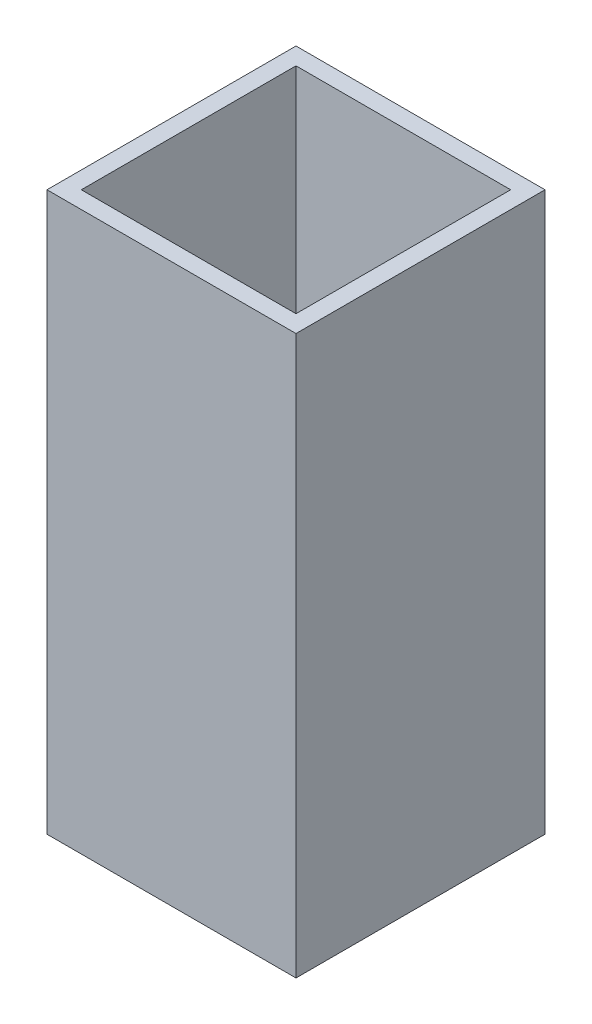
ISO-10303-21;
HEADER;
FILE_DESCRIPTION(('STEP AP214'),'2;1');
FILE_NAME('part.step','',(''),(''),'','','');
FILE_SCHEMA(('AUTOMOTIVE_DESIGN { 1 0 10303 214 1 1 1 1 }'));
ENDSEC;
DATA;
#1=APPLICATION_CONTEXT('core data for automotive mechanical design processes');
#2=APPLICATION_PROTOCOL_DEFINITION('international standard','automotive_design',2000,#1);
#3=PRODUCT_CONTEXT('',#1,'mechanical');
#4=PRODUCT('Part','Part','',(#3));
#5=PRODUCT_RELATED_PRODUCT_CATEGORY('part','',(#4));
#6=PRODUCT_DEFINITION_FORMATION('','',#4);
#7=PRODUCT_DEFINITION_CONTEXT('part definition',#1,'design');
#8=PRODUCT_DEFINITION('design','',#6,#7);
#9=PRODUCT_DEFINITION_SHAPE('','',#8);
#10=(LENGTH_UNIT() NAMED_UNIT(*) SI_UNIT(.MILLI.,.METRE.));
#11=(NAMED_UNIT(*) PLANE_ANGLE_UNIT() SI_UNIT($,.RADIAN.));
#12=(NAMED_UNIT(*) SI_UNIT($,.STERADIAN.) SOLID_ANGLE_UNIT());
#13=UNCERTAINTY_MEASURE_WITH_UNIT(LENGTH_MEASURE(1.E-05),#10,'distance_accuracy_value','');
#14=(GEOMETRIC_REPRESENTATION_CONTEXT(3) GLOBAL_UNCERTAINTY_ASSIGNED_CONTEXT((#13)) GLOBAL_UNIT_ASSIGNED_CONTEXT((#10,
#11,#12)) REPRESENTATION_CONTEXT('',''));
#15=CARTESIAN_POINT('',(0.,0.,0.));
#16=DIRECTION('',(0.,0.,1.));
#17=DIRECTION('',(1.,0.,0.));
#18=AXIS2_PLACEMENT_3D('',#15,#16,#17);
#19=CARTESIAN_POINT('',(0.,65.,0.));
#20=DIRECTION('',(0.,-1.,0.));
#21=DIRECTION('',(0.,0.,-1.));
#22=AXIS2_PLACEMENT_3D('',#19,#20,#21);
#23=PLANE('',#22);
#24=DIRECTION('',(0.,0.,-1.));
#25=VECTOR('',#24,1.);
#26=CARTESIAN_POINT('',(14.5,65.,14.5));
#27=LINE('',#26,#25);
#28=CARTESIAN_POINT('',(14.5,65.,14.5));
#29=VERTEX_POINT('',#28);
#30=CARTESIAN_POINT('',(14.5,65.,-14.5));
#31=VERTEX_POINT('',#30);
#32=EDGE_CURVE('E130',#29,#31,#27,.T.);
#33=ORIENTED_EDGE('',*,*,#32,.T.);
#34=DIRECTION('',(-1.,0.,0.));
#35=VECTOR('',#34,1.);
#36=CARTESIAN_POINT('',(-14.5,65.,-14.5));
#37=LINE('',#36,#35);
#38=CARTESIAN_POINT('',(-14.5,65.,-14.5));
#39=VERTEX_POINT('',#38);
#40=EDGE_CURVE('E133',#31,#39,#37,.T.);
#41=ORIENTED_EDGE('',*,*,#40,.T.);
#42=DIRECTION('',(0.,0.,1.));
#43=VECTOR('',#42,1.);
#44=CARTESIAN_POINT('',(-14.5,65.,14.5));
#45=LINE('',#44,#43);
#46=CARTESIAN_POINT('',(-14.5,65.,14.5));
#47=VERTEX_POINT('',#46);
#48=EDGE_CURVE('E136',#39,#47,#45,.T.);
#49=ORIENTED_EDGE('',*,*,#48,.T.);
#50=DIRECTION('',(1.,0.,0.));
#51=VECTOR('',#50,1.);
#52=CARTESIAN_POINT('',(-14.5,65.,14.5));
#53=LINE('',#52,#51);
#54=EDGE_CURVE('E138',#47,#29,#53,.T.);
#55=ORIENTED_EDGE('',*,*,#54,.T.);
#56=EDGE_LOOP('',(#33,#41,#49,#55));
#57=FACE_BOUND('',#56,.T.);
#58=DIRECTION('',(0.,0.,-1.));
#59=VECTOR('',#58,1.);
#60=CARTESIAN_POINT('',(12.5,65.,0.));
#61=LINE('',#60,#59);
#62=CARTESIAN_POINT('',(12.5,65.,12.5));
#63=VERTEX_POINT('',#62);
#64=CARTESIAN_POINT('',(12.5,65.,-12.5));
#65=VERTEX_POINT('',#64);
#66=EDGE_CURVE('E118',#63,#65,#61,.T.);
#67=ORIENTED_EDGE('',*,*,#66,.F.);
#68=DIRECTION('',(1.,0.,0.));
#69=VECTOR('',#68,1.);
#70=CARTESIAN_POINT('',(0.,65.,12.5));
#71=LINE('',#70,#69);
#72=CARTESIAN_POINT('',(-12.5,65.,12.5));
#73=VERTEX_POINT('',#72);
#74=EDGE_CURVE('E103',#73,#63,#71,.T.);
#75=ORIENTED_EDGE('',*,*,#74,.F.);
#76=DIRECTION('',(0.,0.,1.));
#77=VECTOR('',#76,1.);
#78=CARTESIAN_POINT('',(-12.5,65.,0.));
#79=LINE('',#78,#77);
#80=CARTESIAN_POINT('',(-12.5,65.,-12.5));
#81=VERTEX_POINT('',#80);
#82=EDGE_CURVE('E127',#81,#73,#79,.T.);
#83=ORIENTED_EDGE('',*,*,#82,.F.);
#84=DIRECTION('',(-1.,0.,0.));
#85=VECTOR('',#84,1.);
#86=CARTESIAN_POINT('',(0.,65.,-12.5));
#87=LINE('',#86,#85);
#88=EDGE_CURVE('E120',#65,#81,#87,.T.);
#89=ORIENTED_EDGE('',*,*,#88,.F.);
#90=EDGE_LOOP('',(#67,#75,#83,#89));
#91=FACE_BOUND('',#90,.T.);
#92=ADVANCED_FACE('F33',(#57,#91),#23,.F.);
#93=CARTESIAN_POINT('',(0.,0.,0.));
#94=DIRECTION('',(0.,-1.,0.));
#95=DIRECTION('',(0.,0.,-1.));
#96=AXIS2_PLACEMENT_3D('',#93,#94,#95);
#97=PLANE('',#96);
#98=DIRECTION('',(0.,0.,-1.));
#99=VECTOR('',#98,1.);
#100=CARTESIAN_POINT('',(14.5,0.,14.5));
#101=LINE('',#100,#99);
#102=CARTESIAN_POINT('',(14.5,0.,14.5));
#103=VERTEX_POINT('',#102);
#104=CARTESIAN_POINT('',(14.5,0.,-14.5));
#105=VERTEX_POINT('',#104);
#106=EDGE_CURVE('E141',#103,#105,#101,.T.);
#107=ORIENTED_EDGE('',*,*,#106,.F.);
#108=DIRECTION('',(1.,0.,0.));
#109=VECTOR('',#108,1.);
#110=CARTESIAN_POINT('',(-14.5,0.,14.5));
#111=LINE('',#110,#109);
#112=CARTESIAN_POINT('',(-14.5,0.,14.5));
#113=VERTEX_POINT('',#112);
#114=EDGE_CURVE('E134',#113,#103,#111,.T.);
#115=ORIENTED_EDGE('',*,*,#114,.F.);
#116=DIRECTION('',(0.,0.,1.));
#117=VECTOR('',#116,1.);
#118=CARTESIAN_POINT('',(-14.5,0.,14.5));
#119=LINE('',#118,#117);
#120=CARTESIAN_POINT('',(-14.5,0.,-14.5));
#121=VERTEX_POINT('',#120);
#122=EDGE_CURVE('E146',#121,#113,#119,.T.);
#123=ORIENTED_EDGE('',*,*,#122,.F.);
#124=DIRECTION('',(-1.,0.,0.));
#125=VECTOR('',#124,1.);
#126=CARTESIAN_POINT('',(-14.5,0.,-14.5));
#127=LINE('',#126,#125);
#128=EDGE_CURVE('E144',#105,#121,#127,.T.);
#129=ORIENTED_EDGE('',*,*,#128,.F.);
#130=EDGE_LOOP('',(#107,#115,#123,#129));
#131=FACE_BOUND('',#130,.T.);
#132=DIRECTION('',(1.,0.,0.));
#133=VECTOR('',#132,1.);
#134=CARTESIAN_POINT('',(0.,0.,12.5));
#135=LINE('',#134,#133);
#136=CARTESIAN_POINT('',(-12.5,0.,12.5));
#137=VERTEX_POINT('',#136);
#138=CARTESIAN_POINT('',(12.5,0.,12.5));
#139=VERTEX_POINT('',#138);
#140=EDGE_CURVE('E101',#137,#139,#135,.T.);
#141=ORIENTED_EDGE('',*,*,#140,.T.);
#142=DIRECTION('',(0.,0.,-1.));
#143=VECTOR('',#142,1.);
#144=CARTESIAN_POINT('',(12.5,0.,0.));
#145=LINE('',#144,#143);
#146=CARTESIAN_POINT('',(12.5,0.,-12.5));
#147=VERTEX_POINT('',#146);
#148=EDGE_CURVE('E109',#139,#147,#145,.T.);
#149=ORIENTED_EDGE('',*,*,#148,.T.);
#150=DIRECTION('',(-1.,0.,0.));
#151=VECTOR('',#150,1.);
#152=CARTESIAN_POINT('',(0.,0.,-12.5));
#153=LINE('',#152,#151);
#154=CARTESIAN_POINT('',(-12.5,0.,-12.5));
#155=VERTEX_POINT('',#154);
#156=EDGE_CURVE('E115',#147,#155,#153,.T.);
#157=ORIENTED_EDGE('',*,*,#156,.T.);
#158=DIRECTION('',(0.,0.,1.));
#159=VECTOR('',#158,1.);
#160=CARTESIAN_POINT('',(-12.5,0.,0.));
#161=LINE('',#160,#159);
#162=EDGE_CURVE('E55',#155,#137,#161,.T.);
#163=ORIENTED_EDGE('',*,*,#162,.T.);
#164=EDGE_LOOP('',(#141,#149,#157,#163));
#165=FACE_BOUND('',#164,.T.);
#166=ADVANCED_FACE('F117',(#131,#165),#97,.T.);
#167=CARTESIAN_POINT('',(14.5,65.,14.5));
#168=DIRECTION('',(-1.,0.,0.));
#169=DIRECTION('',(0.,0.,1.));
#170=AXIS2_PLACEMENT_3D('',#167,#168,#169);
#171=PLANE('',#170);
#172=ORIENTED_EDGE('',*,*,#106,.T.);
#173=DIRECTION('',(0.,-1.,0.));
#174=VECTOR('',#173,1.);
#175=CARTESIAN_POINT('',(14.5,65.,-14.5));
#176=LINE('',#175,#174);
#177=EDGE_CURVE('E11',#31,#105,#176,.T.);
#178=ORIENTED_EDGE('',*,*,#177,.F.);
#179=ORIENTED_EDGE('',*,*,#32,.F.);
#180=DIRECTION('',(0.,-1.,0.));
#181=VECTOR('',#180,1.);
#182=CARTESIAN_POINT('',(14.5,65.,14.5));
#183=LINE('',#182,#181);
#184=EDGE_CURVE('E140',#29,#103,#183,.T.);
#185=ORIENTED_EDGE('',*,*,#184,.T.);
#186=EDGE_LOOP('',(#172,#178,#179,#185));
#187=FACE_BOUND('',#186,.T.);
#188=ADVANCED_FACE('F35',(#187),#171,.F.);
#189=CARTESIAN_POINT('',(-14.5,65.,-14.5));
#190=DIRECTION('',(0.,0.,1.));
#191=DIRECTION('',(1.,0.,0.));
#192=AXIS2_PLACEMENT_3D('',#189,#190,#191);
#193=PLANE('',#192);
#194=ORIENTED_EDGE('',*,*,#128,.T.);
#195=DIRECTION('',(0.,-1.,0.));
#196=VECTOR('',#195,1.);
#197=CARTESIAN_POINT('',(-14.5,65.,-14.5));
#198=LINE('',#197,#196);
#199=EDGE_CURVE('E41',#39,#121,#198,.T.);
#200=ORIENTED_EDGE('',*,*,#199,.F.);
#201=ORIENTED_EDGE('',*,*,#40,.F.);
#202=ORIENTED_EDGE('',*,*,#177,.T.);
#203=EDGE_LOOP('',(#194,#200,#201,#202));
#204=FACE_BOUND('',#203,.T.);
#205=ADVANCED_FACE('F173',(#204),#193,.F.);
#206=CARTESIAN_POINT('',(-14.5,65.,14.5));
#207=DIRECTION('',(1.,0.,0.));
#208=DIRECTION('',(0.,0.,-1.));
#209=AXIS2_PLACEMENT_3D('',#206,#207,#208);
#210=PLANE('',#209);
#211=ORIENTED_EDGE('',*,*,#122,.T.);
#212=DIRECTION('',(0.,-1.,0.));
#213=VECTOR('',#212,1.);
#214=CARTESIAN_POINT('',(-14.5,65.,14.5));
#215=LINE('',#214,#213);
#216=EDGE_CURVE('E151',#47,#113,#215,.T.);
#217=ORIENTED_EDGE('',*,*,#216,.F.);
#218=ORIENTED_EDGE('',*,*,#48,.F.);
#219=ORIENTED_EDGE('',*,*,#199,.T.);
#220=EDGE_LOOP('',(#211,#217,#218,#219));
#221=FACE_BOUND('',#220,.T.);
#222=ADVANCED_FACE('F158',(#221),#210,.F.);
#223=CARTESIAN_POINT('',(-14.5,65.,14.5));
#224=DIRECTION('',(0.,0.,-1.));
#225=DIRECTION('',(-1.,0.,0.));
#226=AXIS2_PLACEMENT_3D('',#223,#224,#225);
#227=PLANE('',#226);
#228=ORIENTED_EDGE('',*,*,#114,.T.);
#229=ORIENTED_EDGE('',*,*,#184,.F.);
#230=ORIENTED_EDGE('',*,*,#54,.F.);
#231=ORIENTED_EDGE('',*,*,#216,.T.);
#232=EDGE_LOOP('',(#228,#229,#230,#231));
#233=FACE_BOUND('',#232,.T.);
#234=ADVANCED_FACE('F166',(#233),#227,.F.);
#235=CARTESIAN_POINT('',(12.5,65.,14.5));
#236=DIRECTION('',(-1.,0.,0.));
#237=DIRECTION('',(0.,0.,1.));
#238=AXIS2_PLACEMENT_3D('',#235,#236,#237);
#239=PLANE('',#238);
#240=ORIENTED_EDGE('',*,*,#148,.F.);
#241=DIRECTION('',(0.,-1.,0.));
#242=VECTOR('',#241,1.);
#243=CARTESIAN_POINT('',(12.5,65.,12.5));
#244=LINE('',#243,#242);
#245=EDGE_CURVE('E97',#63,#139,#244,.T.);
#246=ORIENTED_EDGE('',*,*,#245,.F.);
#247=ORIENTED_EDGE('',*,*,#66,.T.);
#248=DIRECTION('',(0.,-1.,0.));
#249=VECTOR('',#248,1.);
#250=CARTESIAN_POINT('',(12.5,65.,-12.5));
#251=LINE('',#250,#249);
#252=EDGE_CURVE('E112',#65,#147,#251,.T.);
#253=ORIENTED_EDGE('',*,*,#252,.T.);
#254=EDGE_LOOP('',(#240,#246,#247,#253));
#255=FACE_BOUND('',#254,.T.);
#256=ADVANCED_FACE('F110',(#255),#239,.T.);
#257=CARTESIAN_POINT('',(-14.5,65.,-12.5));
#258=DIRECTION('',(0.,0.,1.));
#259=DIRECTION('',(1.,0.,0.));
#260=AXIS2_PLACEMENT_3D('',#257,#258,#259);
#261=PLANE('',#260);
#262=ORIENTED_EDGE('',*,*,#156,.F.);
#263=ORIENTED_EDGE('',*,*,#252,.F.);
#264=ORIENTED_EDGE('',*,*,#88,.T.);
#265=DIRECTION('',(0.,-1.,0.));
#266=VECTOR('',#265,1.);
#267=CARTESIAN_POINT('',(-12.5,65.,-12.5));
#268=LINE('',#267,#266);
#269=EDGE_CURVE('E256',#81,#155,#268,.T.);
#270=ORIENTED_EDGE('',*,*,#269,.T.);
#271=EDGE_LOOP('',(#262,#263,#264,#270));
#272=FACE_BOUND('',#271,.T.);
#273=ADVANCED_FACE('F193',(#272),#261,.T.);
#274=CARTESIAN_POINT('',(-12.5,65.,14.5));
#275=DIRECTION('',(1.,0.,0.));
#276=DIRECTION('',(0.,0.,-1.));
#277=AXIS2_PLACEMENT_3D('',#274,#275,#276);
#278=PLANE('',#277);
#279=ORIENTED_EDGE('',*,*,#162,.F.);
#280=ORIENTED_EDGE('',*,*,#269,.F.);
#281=ORIENTED_EDGE('',*,*,#82,.T.);
#282=DIRECTION('',(0.,-1.,0.));
#283=VECTOR('',#282,1.);
#284=CARTESIAN_POINT('',(-12.5,65.,12.5));
#285=LINE('',#284,#283);
#286=EDGE_CURVE('E48',#73,#137,#285,.T.);
#287=ORIENTED_EDGE('',*,*,#286,.T.);
#288=EDGE_LOOP('',(#279,#280,#281,#287));
#289=FACE_BOUND('',#288,.T.);
#290=ADVANCED_FACE('F198',(#289),#278,.T.);
#291=CARTESIAN_POINT('',(-14.5,65.,12.5));
#292=DIRECTION('',(0.,0.,-1.));
#293=DIRECTION('',(-1.,0.,0.));
#294=AXIS2_PLACEMENT_3D('',#291,#292,#293);
#295=PLANE('',#294);
#296=ORIENTED_EDGE('',*,*,#140,.F.);
#297=ORIENTED_EDGE('',*,*,#286,.F.);
#298=ORIENTED_EDGE('',*,*,#74,.T.);
#299=ORIENTED_EDGE('',*,*,#245,.T.);
#300=EDGE_LOOP('',(#296,#297,#298,#299));
#301=FACE_BOUND('',#300,.T.);
#302=ADVANCED_FACE('F99',(#301),#295,.T.);
#303=CLOSED_SHELL('',(#92,#166,#188,#205,#222,#234,#256,#273,#290,#302));
#304=MANIFOLD_SOLID_BREP('B2',#303);
#305=ADVANCED_BREP_SHAPE_REPRESENTATION('',(#18,#304),#14);
#306=SHAPE_DEFINITION_REPRESENTATION(#9,#305);
ENDSEC;
END-ISO-10303-21;
